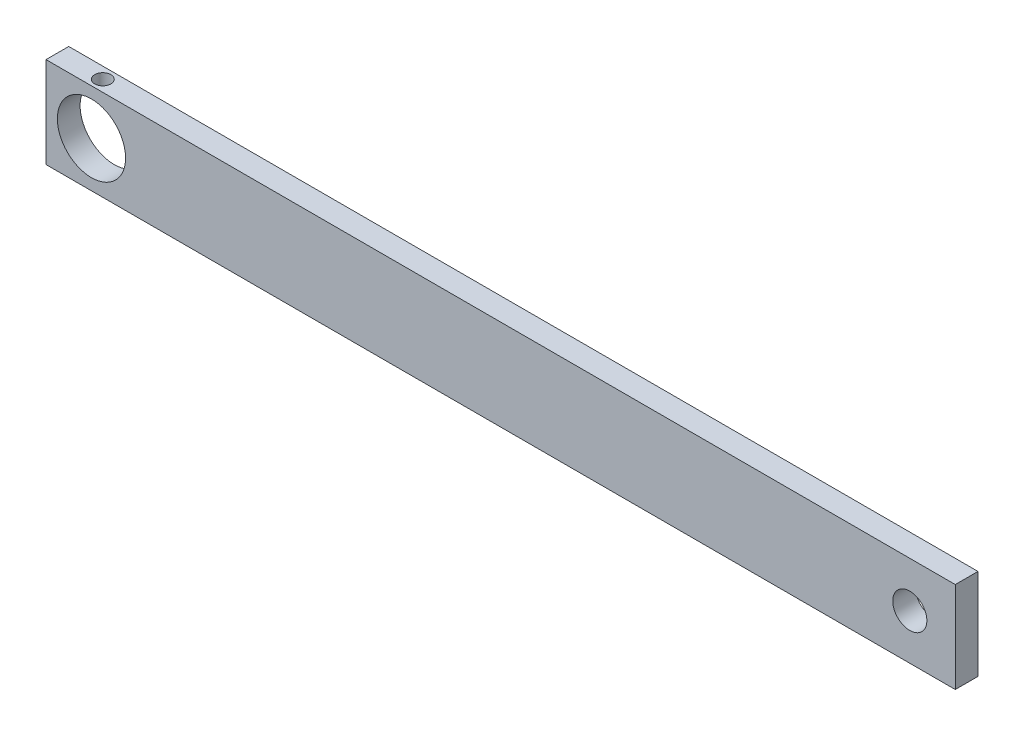
ISO-10303-21;
HEADER;
FILE_DESCRIPTION(('STEP AP214'),'2;1');
FILE_NAME('part.step','',(''),(''),'','','');
FILE_SCHEMA(('AUTOMOTIVE_DESIGN { 1 0 10303 214 1 1 1 1 }'));
ENDSEC;
DATA;
#1=APPLICATION_CONTEXT('core data for automotive mechanical design processes');
#2=APPLICATION_PROTOCOL_DEFINITION('international standard','automotive_design',2000,#1);
#3=PRODUCT_CONTEXT('',#1,'mechanical');
#4=PRODUCT('Part','Part','',(#3));
#5=PRODUCT_RELATED_PRODUCT_CATEGORY('part','',(#4));
#6=PRODUCT_DEFINITION_FORMATION('','',#4);
#7=PRODUCT_DEFINITION_CONTEXT('part definition',#1,'design');
#8=PRODUCT_DEFINITION('design','',#6,#7);
#9=PRODUCT_DEFINITION_SHAPE('','',#8);
#10=(LENGTH_UNIT() NAMED_UNIT(*) SI_UNIT(.MILLI.,.METRE.));
#11=(NAMED_UNIT(*) PLANE_ANGLE_UNIT() SI_UNIT($,.RADIAN.));
#12=(NAMED_UNIT(*) SI_UNIT($,.STERADIAN.) SOLID_ANGLE_UNIT());
#13=UNCERTAINTY_MEASURE_WITH_UNIT(LENGTH_MEASURE(1.E-05),#10,'distance_accuracy_value','');
#14=(GEOMETRIC_REPRESENTATION_CONTEXT(3) GLOBAL_UNCERTAINTY_ASSIGNED_CONTEXT((#13)) GLOBAL_UNIT_ASSIGNED_CONTEXT((#10,
#11,#12)) REPRESENTATION_CONTEXT('',''));
#15=CARTESIAN_POINT('',(0.,0.,0.));
#16=DIRECTION('',(0.,0.,1.));
#17=DIRECTION('',(1.,0.,0.));
#18=AXIS2_PLACEMENT_3D('',#15,#16,#17);
#19=CARTESIAN_POINT('',(0.,0.,3.175));
#20=DIRECTION('',(0.,0.,-1.));
#21=DIRECTION('',(-1.,0.,0.));
#22=AXIS2_PLACEMENT_3D('',#19,#20,#21);
#23=PLANE('',#22);
#24=DIRECTION('',(0.,-1.,0.));
#25=VECTOR('',#24,1.);
#26=CARTESIAN_POINT('',(0.,0.,3.175));
#27=LINE('',#26,#25);
#28=CARTESIAN_POINT('',(0.,12.7,3.175));
#29=VERTEX_POINT('',#28);
#30=CARTESIAN_POINT('',(0.,0.,3.175));
#31=VERTEX_POINT('',#30);
#32=EDGE_CURVE('E98',#29,#31,#27,.T.);
#33=ORIENTED_EDGE('',*,*,#32,.T.);
#34=DIRECTION('',(1.,0.,0.));
#35=VECTOR('',#34,1.);
#36=CARTESIAN_POINT('',(0.,0.,3.175));
#37=LINE('',#36,#35);
#38=CARTESIAN_POINT('',(127.,0.,3.175));
#39=VERTEX_POINT('',#38);
#40=EDGE_CURVE('E93',#31,#39,#37,.T.);
#41=ORIENTED_EDGE('',*,*,#40,.T.);
#42=DIRECTION('',(0.,1.,0.));
#43=VECTOR('',#42,1.);
#44=CARTESIAN_POINT('',(127.,0.,3.175));
#45=LINE('',#44,#43);
#46=CARTESIAN_POINT('',(127.,12.7,3.175));
#47=VERTEX_POINT('',#46);
#48=EDGE_CURVE('E96',#39,#47,#45,.T.);
#49=ORIENTED_EDGE('',*,*,#48,.T.);
#50=DIRECTION('',(-1.,0.,0.));
#51=VECTOR('',#50,1.);
#52=CARTESIAN_POINT('',(0.,12.7,3.175));
#53=LINE('',#52,#51);
#54=EDGE_CURVE('E63',#47,#29,#53,.T.);
#55=ORIENTED_EDGE('',*,*,#54,.T.);
#56=EDGE_LOOP('',(#33,#41,#49,#55));
#57=FACE_BOUND('',#56,.T.);
#58=CARTESIAN_POINT('',(6.35,6.35,3.175));
#59=DIRECTION('',(0.,0.,1.));
#60=DIRECTION('',(1.,0.,0.));
#61=AXIS2_PLACEMENT_3D('',#58,#59,#60);
#62=CIRCLE('',#61,4.7625);
#63=CARTESIAN_POINT('',(11.1125,6.35,3.175));
#64=VERTEX_POINT('',#63);
#65=EDGE_CURVE('E119',#64,#64,#62,.T.);
#66=ORIENTED_EDGE('',*,*,#65,.F.);
#67=EDGE_LOOP('',(#66));
#68=FACE_BOUND('',#67,.T.);
#69=CARTESIAN_POINT('',(120.65,6.35,3.175));
#70=DIRECTION('',(0.,0.,1.));
#71=DIRECTION('',(1.,0.,0.));
#72=AXIS2_PLACEMENT_3D('',#69,#70,#71);
#73=CIRCLE('',#72,2.38125000000001);
#74=CARTESIAN_POINT('',(123.03125,6.35,3.175));
#75=VERTEX_POINT('',#74);
#76=EDGE_CURVE('E141',#75,#75,#73,.T.);
#77=ORIENTED_EDGE('',*,*,#76,.F.);
#78=EDGE_LOOP('',(#77));
#79=FACE_BOUND('',#78,.T.);
#80=ADVANCED_FACE('F39',(#57,#68,#79),#23,.F.);
#81=CARTESIAN_POINT('',(0.,0.,0.));
#82=DIRECTION('',(0.,0.,-1.));
#83=DIRECTION('',(-1.,0.,0.));
#84=AXIS2_PLACEMENT_3D('',#81,#82,#83);
#85=PLANE('',#84);
#86=CARTESIAN_POINT('',(6.35,6.35,0.));
#87=DIRECTION('',(0.,0.,1.));
#88=DIRECTION('',(1.,0.,0.));
#89=AXIS2_PLACEMENT_3D('',#86,#87,#88);
#90=CIRCLE('',#89,4.7625);
#91=CARTESIAN_POINT('',(11.1125,6.35,0.));
#92=VERTEX_POINT('',#91);
#93=EDGE_CURVE('E137',#92,#92,#90,.T.);
#94=ORIENTED_EDGE('',*,*,#93,.T.);
#95=EDGE_LOOP('',(#94));
#96=FACE_BOUND('',#95,.T.);
#97=DIRECTION('',(0.,-1.,0.));
#98=VECTOR('',#97,1.);
#99=CARTESIAN_POINT('',(0.,0.,0.));
#100=LINE('',#99,#98);
#101=CARTESIAN_POINT('',(0.,12.7,0.));
#102=VERTEX_POINT('',#101);
#103=CARTESIAN_POINT('',(0.,0.,0.));
#104=VERTEX_POINT('',#103);
#105=EDGE_CURVE('E115',#102,#104,#100,.T.);
#106=ORIENTED_EDGE('',*,*,#105,.F.);
#107=DIRECTION('',(-1.,0.,0.));
#108=VECTOR('',#107,1.);
#109=CARTESIAN_POINT('',(0.,12.7,0.));
#110=LINE('',#109,#108);
#111=CARTESIAN_POINT('',(127.,12.7,0.));
#112=VERTEX_POINT('',#111);
#113=EDGE_CURVE('E86',#112,#102,#110,.T.);
#114=ORIENTED_EDGE('',*,*,#113,.F.);
#115=DIRECTION('',(0.,1.,0.));
#116=VECTOR('',#115,1.);
#117=CARTESIAN_POINT('',(127.,0.,0.));
#118=LINE('',#117,#116);
#119=CARTESIAN_POINT('',(127.,0.,0.));
#120=VERTEX_POINT('',#119);
#121=EDGE_CURVE('E80',#120,#112,#118,.T.);
#122=ORIENTED_EDGE('',*,*,#121,.F.);
#123=DIRECTION('',(1.,0.,0.));
#124=VECTOR('',#123,1.);
#125=CARTESIAN_POINT('',(0.,0.,0.));
#126=LINE('',#125,#124);
#127=EDGE_CURVE('E103',#104,#120,#126,.T.);
#128=ORIENTED_EDGE('',*,*,#127,.F.);
#129=EDGE_LOOP('',(#106,#114,#122,#128));
#130=FACE_BOUND('',#129,.T.);
#131=CARTESIAN_POINT('',(120.65,6.35,0.));
#132=DIRECTION('',(0.,0.,1.));
#133=DIRECTION('',(1.,0.,0.));
#134=AXIS2_PLACEMENT_3D('',#131,#132,#133);
#135=CIRCLE('',#134,2.38125000000001);
#136=CARTESIAN_POINT('',(123.03125,6.35,0.));
#137=VERTEX_POINT('',#136);
#138=EDGE_CURVE('E145',#137,#137,#135,.T.);
#139=ORIENTED_EDGE('',*,*,#138,.T.);
#140=EDGE_LOOP('',(#139));
#141=FACE_BOUND('',#140,.T.);
#142=ADVANCED_FACE('F132',(#96,#130,#141),#85,.T.);
#143=CARTESIAN_POINT('',(0.,0.,3.175));
#144=DIRECTION('',(1.,0.,0.));
#145=DIRECTION('',(0.,0.,-1.));
#146=AXIS2_PLACEMENT_3D('',#143,#144,#145);
#147=PLANE('',#146);
#148=ORIENTED_EDGE('',*,*,#105,.T.);
#149=DIRECTION('',(0.,0.,-1.));
#150=VECTOR('',#149,1.);
#151=CARTESIAN_POINT('',(0.,0.,3.175));
#152=LINE('',#151,#150);
#153=EDGE_CURVE('E11',#31,#104,#152,.T.);
#154=ORIENTED_EDGE('',*,*,#153,.F.);
#155=ORIENTED_EDGE('',*,*,#32,.F.);
#156=DIRECTION('',(0.,0.,-1.));
#157=VECTOR('',#156,1.);
#158=CARTESIAN_POINT('',(0.,12.7,3.175));
#159=LINE('',#158,#157);
#160=EDGE_CURVE('E111',#29,#102,#159,.T.);
#161=ORIENTED_EDGE('',*,*,#160,.T.);
#162=EDGE_LOOP('',(#148,#154,#155,#161));
#163=FACE_BOUND('',#162,.T.);
#164=ADVANCED_FACE('F41',(#163),#147,.F.);
#165=CARTESIAN_POINT('',(0.,0.,3.175));
#166=DIRECTION('',(0.,1.,0.));
#167=DIRECTION('',(0.,0.,1.));
#168=AXIS2_PLACEMENT_3D('',#165,#166,#167);
#169=PLANE('',#168);
#170=ORIENTED_EDGE('',*,*,#127,.T.);
#171=DIRECTION('',(0.,0.,-1.));
#172=VECTOR('',#171,1.);
#173=CARTESIAN_POINT('',(127.,0.,3.175));
#174=LINE('',#173,#172);
#175=EDGE_CURVE('E55',#39,#120,#174,.T.);
#176=ORIENTED_EDGE('',*,*,#175,.F.);
#177=ORIENTED_EDGE('',*,*,#40,.F.);
#178=ORIENTED_EDGE('',*,*,#153,.T.);
#179=EDGE_LOOP('',(#170,#176,#177,#178));
#180=FACE_BOUND('',#179,.T.);
#181=ADVANCED_FACE('F102',(#180),#169,.F.);
#182=CARTESIAN_POINT('',(127.,0.,3.175));
#183=DIRECTION('',(-1.,0.,0.));
#184=DIRECTION('',(0.,0.,1.));
#185=AXIS2_PLACEMENT_3D('',#182,#183,#184);
#186=PLANE('',#185);
#187=ORIENTED_EDGE('',*,*,#121,.T.);
#188=DIRECTION('',(0.,0.,-1.));
#189=VECTOR('',#188,1.);
#190=CARTESIAN_POINT('',(127.,12.7,3.175));
#191=LINE('',#190,#189);
#192=EDGE_CURVE('E105',#47,#112,#191,.T.);
#193=ORIENTED_EDGE('',*,*,#192,.F.);
#194=ORIENTED_EDGE('',*,*,#48,.F.);
#195=ORIENTED_EDGE('',*,*,#175,.T.);
#196=EDGE_LOOP('',(#187,#193,#194,#195));
#197=FACE_BOUND('',#196,.T.);
#198=ADVANCED_FACE('F107',(#197),#186,.F.);
#199=CARTESIAN_POINT('',(0.,12.7,3.175));
#200=DIRECTION('',(0.,-1.,0.));
#201=DIRECTION('',(0.,0.,-1.));
#202=AXIS2_PLACEMENT_3D('',#199,#200,#201);
#203=PLANE('',#202);
#204=CARTESIAN_POINT('',(6.35,12.7,1.5875));
#205=DIRECTION('',(0.,1.,0.));
#206=DIRECTION('',(0.,0.,1.));
#207=AXIS2_PLACEMENT_3D('',#204,#205,#206);
#208=CIRCLE('',#207,1.1303);
#209=CARTESIAN_POINT('',(6.35,12.7,2.7178));
#210=VERTEX_POINT('',#209);
#211=EDGE_CURVE('E152',#210,#210,#208,.T.);
#212=ORIENTED_EDGE('',*,*,#211,.F.);
#213=EDGE_LOOP('',(#212));
#214=FACE_BOUND('',#213,.T.);
#215=ORIENTED_EDGE('',*,*,#113,.T.);
#216=ORIENTED_EDGE('',*,*,#160,.F.);
#217=ORIENTED_EDGE('',*,*,#54,.F.);
#218=ORIENTED_EDGE('',*,*,#192,.T.);
#219=EDGE_LOOP('',(#215,#216,#217,#218));
#220=FACE_BOUND('',#219,.T.);
#221=ADVANCED_FACE('F129',(#214,#220),#203,.F.);
#222=CARTESIAN_POINT('',(6.35,6.35,3.175));
#223=DIRECTION('',(0.,0.,-1.));
#224=DIRECTION('',(-1.,0.,0.));
#225=AXIS2_PLACEMENT_3D('',#222,#223,#224);
#226=CYLINDRICAL_SURFACE('',#225,4.7625);
#227=CARTESIAN_POINT('',(6.35,11.1125,2.7178));
#228=CARTESIAN_POINT('',(6.28744955283499,11.1124988865825,2.7177980723915));
#229=CARTESIAN_POINT('',(6.22487687071659,11.1112553161925,2.71259021829287));
#230=CARTESIAN_POINT('',(6.10151815596171,11.1064147943901,2.69192356035694));
#231=CARTESIAN_POINT('',(6.04073327174953,11.1028163633628,2.67645831147165));
#232=CARTESIAN_POINT('',(5.92274995215742,11.0936655135628,2.63579586247847));
#233=CARTESIAN_POINT('',(5.86554752827564,11.0881153150323,2.61060971725877));
#234=CARTESIAN_POINT('',(5.75618069062627,11.0756553376375,2.5512577484063));
#235=CARTESIAN_POINT('',(5.70401632304256,11.0687455463114,2.51709184246672));
#236=CARTESIAN_POINT('',(5.60523021807948,11.0541749466086,2.44007488787854));
#237=CARTESIAN_POINT('',(5.55871613294408,11.0465034846582,2.39708776488231));
#238=CARTESIAN_POINT('',(5.47348569875701,11.0313467099217,2.30394029184915));
#239=CARTESIAN_POINT('',(5.43477014838208,11.0238614162704,2.25377920799906));
#240=CARTESIAN_POINT('',(5.36574269672542,11.0098181301872,2.14688860226831));
#241=CARTESIAN_POINT('',(5.33554877080356,11.0032737183417,2.09008094945983));
#242=CARTESIAN_POINT('',(5.28517951719828,10.9920075658876,1.97201628766717));
#243=CARTESIAN_POINT('',(5.26500276011121,10.9872855652508,1.91075991492552));
#244=CARTESIAN_POINT('',(5.23560304162459,10.9803079818496,1.78671390336463));
#245=CARTESIAN_POINT('',(5.22618773340615,10.978009148246,1.72397233950669));
#246=CARTESIAN_POINT('',(5.21797947304019,10.9760085427773,1.59776132355056));
#247=CARTESIAN_POINT('',(5.21918497273479,10.9763063924025,1.5342919788854));
#248=CARTESIAN_POINT('',(5.23203008980736,10.9794265033392,1.40988235124524));
#249=CARTESIAN_POINT('',(5.24344296527846,10.982193904211,1.34891706945381));
#250=CARTESIAN_POINT('',(5.27601820282784,10.9898541656576,1.22979209319917));
#251=CARTESIAN_POINT('',(5.29718119794532,10.9947471642385,1.1716325811751));
#252=CARTESIAN_POINT('',(5.34885538408826,11.0061592038804,1.0591497691327));
#253=CARTESIAN_POINT('',(5.37945090776433,11.0126928110462,1.00486675088252));
#254=CARTESIAN_POINT('',(5.44906255162789,11.0266413798207,0.902122804077572));
#255=CARTESIAN_POINT('',(5.48808000999913,11.0340564814083,0.853662802664598));
#256=CARTESIAN_POINT('',(5.57461330508017,11.049165397608,0.762638489031651));
#257=CARTESIAN_POINT('',(5.62232111828981,11.0568614878912,0.720256850377527));
#258=CARTESIAN_POINT('',(5.72425734540131,11.0714933604203,0.644063027387462));
#259=CARTESIAN_POINT('',(5.7784859216433,11.0784291237292,0.610251056466074));
#260=CARTESIAN_POINT('',(5.89216908129202,11.0907880498009,0.552098634956739));
#261=CARTESIAN_POINT('',(5.95163811088905,11.0962068476709,0.527785438179983));
#262=CARTESIAN_POINT('',(6.07397574450878,11.1048893170039,0.489550155907932));
#263=CARTESIAN_POINT('',(6.13684376216935,11.1081533589102,0.475626284237196));
#264=CARTESIAN_POINT('',(6.26263084096385,11.112104602668,0.458838279169913));
#265=CARTESIAN_POINT('',(6.32551488403933,11.1128498269125,0.455725069078419));
#266=CARTESIAN_POINT('',(6.45090491426254,11.111843607238,0.459966989421537));
#267=CARTESIAN_POINT('',(6.51341093147156,11.1100923645355,0.467321276170563));
#268=CARTESIAN_POINT('',(6.63542196630475,11.1043269344029,0.492083534682473));
#269=CARTESIAN_POINT('',(6.69495566581423,11.1003428542527,0.509357821394562));
#270=CARTESIAN_POINT('',(6.8102787703941,11.090559236905,0.553318845652636));
#271=CARTESIAN_POINT('',(6.86606781969134,11.084759527503,0.580006476042733));
#272=CARTESIAN_POINT('',(6.97332543618619,11.0718470983634,0.642534462531474));
#273=CARTESIAN_POINT('',(7.02470854951426,11.0647144795269,0.678517197145443));
#274=CARTESIAN_POINT('',(7.12079615992167,11.0499624207733,0.758429726750764));
#275=CARTESIAN_POINT('',(7.16549962259093,11.0423429057158,0.802360750289361));
#276=CARTESIAN_POINT('',(7.24796816550513,11.0272704338935,0.898074112506389));
#277=CARTESIAN_POINT('',(7.28555939296499,11.0198248051445,0.950007632820697));
#278=CARTESIAN_POINT('',(7.35149022808019,11.0061316481059,1.05959495613261));
#279=CARTESIAN_POINT('',(7.3798302497261,10.999884066209,1.11724850300898));
#280=CARTESIAN_POINT('',(7.42624913236191,10.9893599617366,1.23632459697878));
#281=CARTESIAN_POINT('',(7.4443883213257,10.9850718795252,1.29772255286584));
#282=CARTESIAN_POINT('',(7.47005827002546,10.978936502864,1.42281220674057));
#283=CARTESIAN_POINT('',(7.47759108086313,10.977088736501,1.48650345879796));
#284=CARTESIAN_POINT('',(7.48173541942955,10.9760766037874,1.61260978036333));
#285=CARTESIAN_POINT('',(7.47862381464116,10.9768442080156,1.6750153584529));
#286=CARTESIAN_POINT('',(7.46219513075476,10.9808204794984,1.79838506708797));
#287=CARTESIAN_POINT('',(7.44887821898313,10.98402910673,1.85934922125018));
#288=CARTESIAN_POINT('',(7.41256106322215,10.9924899209893,1.97783856889195));
#289=CARTESIAN_POINT('',(7.38960787796393,10.9977321675123,2.03537894380876));
#290=CARTESIAN_POINT('',(7.33470791962195,11.0096719042307,2.14583073212595));
#291=CARTESIAN_POINT('',(7.30276002488179,11.0163695758964,2.19874156713509));
#292=CARTESIAN_POINT('',(7.22988849001301,11.0306633754278,2.29978172085009));
#293=CARTESIAN_POINT('',(7.18877051437428,11.0382770000375,2.34776843242637));
#294=CARTESIAN_POINT('',(7.09911118377216,11.0534351287937,2.43625116750189));
#295=CARTESIAN_POINT('',(7.05056809223497,11.060979616332,2.47674543377223));
#296=CARTESIAN_POINT('',(6.94650653959859,11.0752920511139,2.54971635688838));
#297=CARTESIAN_POINT('',(6.89088956812342,11.0820457675814,2.58205551187322));
#298=CARTESIAN_POINT('',(6.7748561083923,11.0938689802809,2.63687395279317));
#299=CARTESIAN_POINT('',(6.7144433521323,11.0989397705207,2.65936081846656));
#300=CARTESIAN_POINT('',(6.60338613740223,11.1060101234678,2.6902135399803));
#301=CARTESIAN_POINT('',(6.55330299881233,11.1084278149656,2.70053723707079));
#302=CARTESIAN_POINT('',(6.45215147657873,11.1116731594754,2.71433104555366));
#303=CARTESIAN_POINT('',(6.40108315311226,11.1125009092961,2.71780157422249));
#304=CARTESIAN_POINT('',(6.35,11.1125,2.7178));
#305=B_SPLINE_CURVE_WITH_KNOTS('',3,(#227,#228,#229,#230,#231,#232,#233,#234,#235,#236,#237,
#238,#239,#240,#241,#242,#243,#244,#245,#246,#247,#248,#249,#250,#251,#252,#253,#254,#255,#256,
#257,#258,#259,#260,#261,#262,#263,#264,#265,#266,#267,#268,#269,#270,#271,#272,#273,#274,#275,
#276,#277,#278,#279,#280,#281,#282,#283,#284,#285,#286,#287,#288,#289,#290,#291,#292,#293,#294,
#295,#296,#297,#298,#299,#300,#301,#302,#303,#304),.UNSPECIFIED.,.T.,.F.,(4,2,2,2,2,2,2,2,2,2,2,
2,2,2,2,2,2,2,2,2,2,2,2,2,2,2,2,2,2,2,2,2,2,2,2,2,2,2,4),(0.,0.187464233445307,
0.375046368371234,0.56241580497872,0.749786959039265,0.940301149532557,1.13083484137835,
1.323889669599,1.51691694186557,1.70643733003011,1.89593009293011,2.08131531006457,
2.26671256527165,2.4538179686575,2.64095312363527,2.83287860741468,3.0248088703371,
3.21728584337239,3.40972971734641,3.59770916783967,3.78567346795129,3.97116223372724,
4.15666859761835,4.34520498082457,4.53377053056524,4.72647545534149,4.91917175540811,
5.11071612615483,5.30222345023359,5.48878783947736,5.67534916987401,5.86100983556771,
6.04669366374176,6.23676713117169,6.42688512083311,6.6200215835062,6.81300919697153,
6.96611517316015,7.11921182672839),.UNSPECIFIED.);
#306=CARTESIAN_POINT('',(6.35,11.1125,2.7178));
#307=VERTEX_POINT('',#306);
#308=EDGE_CURVE('E43',#307,#307,#305,.T.);
#309=ORIENTED_EDGE('',*,*,#308,.F.);
#310=EDGE_LOOP('',(#309));
#311=FACE_BOUND('',#310,.T.);
#312=ORIENTED_EDGE('',*,*,#65,.T.);
#313=EDGE_LOOP('',(#312));
#314=FACE_BOUND('',#313,.T.);
#315=ORIENTED_EDGE('',*,*,#93,.F.);
#316=EDGE_LOOP('',(#315));
#317=FACE_BOUND('',#316,.T.);
#318=ADVANCED_FACE('F163',(#311,#314,#317),#226,.F.);
#319=CARTESIAN_POINT('',(120.65,6.35,3.175));
#320=DIRECTION('',(0.,0.,-1.));
#321=DIRECTION('',(-1.,0.,0.));
#322=AXIS2_PLACEMENT_3D('',#319,#320,#321);
#323=CYLINDRICAL_SURFACE('',#322,2.38125000000001);
#324=ORIENTED_EDGE('',*,*,#76,.T.);
#325=EDGE_LOOP('',(#324));
#326=FACE_BOUND('',#325,.T.);
#327=ORIENTED_EDGE('',*,*,#138,.F.);
#328=EDGE_LOOP('',(#327));
#329=FACE_BOUND('',#328,.T.);
#330=ADVANCED_FACE('F166',(#326,#329),#323,.F.);
#331=CARTESIAN_POINT('',(6.35,6.35,1.5875));
#332=DIRECTION('',(0.,1.,0.));
#333=DIRECTION('',(0.,0.,1.));
#334=AXIS2_PLACEMENT_3D('',#331,#332,#333);
#335=CYLINDRICAL_SURFACE('',#334,1.1303);
#336=ORIENTED_EDGE('',*,*,#308,.T.);
#337=EDGE_LOOP('',(#336));
#338=FACE_BOUND('',#337,.T.);
#339=ORIENTED_EDGE('',*,*,#211,.T.);
#340=EDGE_LOOP('',(#339));
#341=FACE_BOUND('',#340,.T.);
#342=ADVANCED_FACE('F161',(#338,#341),#335,.F.);
#343=CLOSED_SHELL('',(#80,#142,#164,#181,#198,#221,#318,#330,#342));
#344=MANIFOLD_SOLID_BREP('B2',#343);
#345=ADVANCED_BREP_SHAPE_REPRESENTATION('',(#18,#344),#14);
#346=SHAPE_DEFINITION_REPRESENTATION(#9,#345);
ENDSEC;
END-ISO-10303-21;
